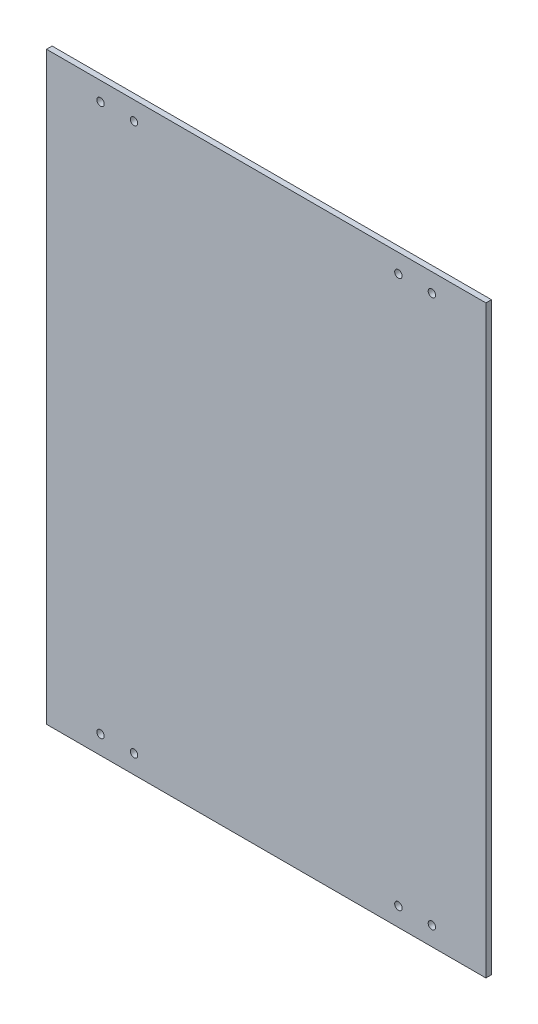
ISO-10303-21;
HEADER;
FILE_DESCRIPTION(('STEP AP214'),'2;1');
FILE_NAME('part.step','',(''),(''),'','','');
FILE_SCHEMA(('AUTOMOTIVE_DESIGN { 1 0 10303 214 1 1 1 1 }'));
ENDSEC;
DATA;
#1=APPLICATION_CONTEXT('core data for automotive mechanical design processes');
#2=APPLICATION_PROTOCOL_DEFINITION('international standard','automotive_design',2000,#1);
#3=PRODUCT_CONTEXT('',#1,'mechanical');
#4=PRODUCT('Part','Part','',(#3));
#5=PRODUCT_RELATED_PRODUCT_CATEGORY('part','',(#4));
#6=PRODUCT_DEFINITION_FORMATION('','',#4);
#7=PRODUCT_DEFINITION_CONTEXT('part definition',#1,'design');
#8=PRODUCT_DEFINITION('design','',#6,#7);
#9=PRODUCT_DEFINITION_SHAPE('','',#8);
#10=(LENGTH_UNIT() NAMED_UNIT(*) SI_UNIT(.MILLI.,.METRE.));
#11=(NAMED_UNIT(*) PLANE_ANGLE_UNIT() SI_UNIT($,.RADIAN.));
#12=(NAMED_UNIT(*) SI_UNIT($,.STERADIAN.) SOLID_ANGLE_UNIT());
#13=UNCERTAINTY_MEASURE_WITH_UNIT(LENGTH_MEASURE(1.E-05),#10,'distance_accuracy_value','');
#14=(GEOMETRIC_REPRESENTATION_CONTEXT(3) GLOBAL_UNCERTAINTY_ASSIGNED_CONTEXT((#13)) GLOBAL_UNIT_ASSIGNED_CONTEXT((#10,
#11,#12)) REPRESENTATION_CONTEXT('',''));
#15=CARTESIAN_POINT('',(0.,0.,0.));
#16=DIRECTION('',(0.,0.,1.));
#17=DIRECTION('',(1.,0.,0.));
#18=AXIS2_PLACEMENT_3D('',#15,#16,#17);
#19=CARTESIAN_POINT('',(-118.,154.,3.));
#20=DIRECTION('',(1.,0.,0.));
#21=DIRECTION('',(0.,1.,0.));
#22=AXIS2_PLACEMENT_3D('',#19,#20,#21);
#23=PLANE('',#22);
#24=DIRECTION('',(0.,-1.,0.));
#25=VECTOR('',#24,1.);
#26=CARTESIAN_POINT('',(-118.,154.,0.));
#27=LINE('',#26,#25);
#28=CARTESIAN_POINT('',(-118.,154.,0.));
#29=VERTEX_POINT('',#28);
#30=CARTESIAN_POINT('',(-118.,-160.,0.));
#31=VERTEX_POINT('',#30);
#32=EDGE_CURVE('E102',#29,#31,#27,.T.);
#33=ORIENTED_EDGE('',*,*,#32,.T.);
#34=DIRECTION('',(0.,0.,-1.));
#35=VECTOR('',#34,1.);
#36=CARTESIAN_POINT('',(-118.,-160.,3.));
#37=LINE('',#36,#35);
#38=CARTESIAN_POINT('',(-118.,-160.,3.));
#39=VERTEX_POINT('',#38);
#40=EDGE_CURVE('E11',#39,#31,#37,.T.);
#41=ORIENTED_EDGE('',*,*,#40,.F.);
#42=DIRECTION('',(0.,-1.,0.));
#43=VECTOR('',#42,1.);
#44=CARTESIAN_POINT('',(-118.,154.,3.));
#45=LINE('',#44,#43);
#46=CARTESIAN_POINT('',(-118.,154.,3.));
#47=VERTEX_POINT('',#46);
#48=EDGE_CURVE('E90',#47,#39,#45,.T.);
#49=ORIENTED_EDGE('',*,*,#48,.F.);
#50=DIRECTION('',(0.,0.,-1.));
#51=VECTOR('',#50,1.);
#52=CARTESIAN_POINT('',(-118.,154.,3.));
#53=LINE('',#52,#51);
#54=EDGE_CURVE('E98',#47,#29,#53,.T.);
#55=ORIENTED_EDGE('',*,*,#54,.T.);
#56=EDGE_LOOP('',(#33,#41,#49,#55));
#57=FACE_BOUND('',#56,.T.);
#58=ADVANCED_FACE('F39',(#57),#23,.F.);
#59=CARTESIAN_POINT('',(118.,-160.,3.));
#60=DIRECTION('',(0.,1.,0.));
#61=DIRECTION('',(-1.,0.,0.));
#62=AXIS2_PLACEMENT_3D('',#59,#60,#61);
#63=PLANE('',#62);
#64=DIRECTION('',(1.,0.,0.));
#65=VECTOR('',#64,1.);
#66=CARTESIAN_POINT('',(118.,-160.,0.));
#67=LINE('',#66,#65);
#68=CARTESIAN_POINT('',(118.,-160.,0.));
#69=VERTEX_POINT('',#68);
#70=EDGE_CURVE('E94',#31,#69,#67,.T.);
#71=ORIENTED_EDGE('',*,*,#70,.T.);
#72=DIRECTION('',(0.,0.,-1.));
#73=VECTOR('',#72,1.);
#74=CARTESIAN_POINT('',(118.,-160.,3.));
#75=LINE('',#74,#73);
#76=CARTESIAN_POINT('',(118.,-160.,3.));
#77=VERTEX_POINT('',#76);
#78=EDGE_CURVE('E47',#77,#69,#75,.T.);
#79=ORIENTED_EDGE('',*,*,#78,.F.);
#80=DIRECTION('',(1.,0.,0.));
#81=VECTOR('',#80,1.);
#82=CARTESIAN_POINT('',(118.,-160.,3.));
#83=LINE('',#82,#81);
#84=EDGE_CURVE('E85',#39,#77,#83,.T.);
#85=ORIENTED_EDGE('',*,*,#84,.F.);
#86=ORIENTED_EDGE('',*,*,#40,.T.);
#87=EDGE_LOOP('',(#71,#79,#85,#86));
#88=FACE_BOUND('',#87,.T.);
#89=ADVANCED_FACE('F93',(#88),#63,.F.);
#90=CARTESIAN_POINT('',(118.,154.,3.));
#91=DIRECTION('',(-1.,0.,0.));
#92=DIRECTION('',(0.,-1.,0.));
#93=AXIS2_PLACEMENT_3D('',#90,#91,#92);
#94=PLANE('',#93);
#95=DIRECTION('',(0.,1.,0.));
#96=VECTOR('',#95,1.);
#97=CARTESIAN_POINT('',(118.,154.,0.));
#98=LINE('',#97,#96);
#99=CARTESIAN_POINT('',(118.,154.,0.));
#100=VERTEX_POINT('',#99);
#101=EDGE_CURVE('E72',#69,#100,#98,.T.);
#102=ORIENTED_EDGE('',*,*,#101,.T.);
#103=DIRECTION('',(0.,0.,-1.));
#104=VECTOR('',#103,1.);
#105=CARTESIAN_POINT('',(118.,154.,3.));
#106=LINE('',#105,#104);
#107=CARTESIAN_POINT('',(118.,154.,3.));
#108=VERTEX_POINT('',#107);
#109=EDGE_CURVE('E95',#108,#100,#106,.T.);
#110=ORIENTED_EDGE('',*,*,#109,.F.);
#111=DIRECTION('',(0.,1.,0.));
#112=VECTOR('',#111,1.);
#113=CARTESIAN_POINT('',(118.,154.,3.));
#114=LINE('',#113,#112);
#115=EDGE_CURVE('E88',#77,#108,#114,.T.);
#116=ORIENTED_EDGE('',*,*,#115,.F.);
#117=ORIENTED_EDGE('',*,*,#78,.T.);
#118=EDGE_LOOP('',(#102,#110,#116,#117));
#119=FACE_BOUND('',#118,.T.);
#120=ADVANCED_FACE('F96',(#119),#94,.F.);
#121=CARTESIAN_POINT('',(-118.,154.,3.));
#122=DIRECTION('',(0.,-1.,0.));
#123=DIRECTION('',(0.,0.,-1.));
#124=AXIS2_PLACEMENT_3D('',#121,#122,#123);
#125=PLANE('',#124);
#126=DIRECTION('',(-1.,0.,0.));
#127=VECTOR('',#126,1.);
#128=CARTESIAN_POINT('',(-118.,154.,0.));
#129=LINE('',#128,#127);
#130=EDGE_CURVE('E78',#100,#29,#129,.T.);
#131=ORIENTED_EDGE('',*,*,#130,.T.);
#132=ORIENTED_EDGE('',*,*,#54,.F.);
#133=DIRECTION('',(-1.,0.,0.));
#134=VECTOR('',#133,1.);
#135=CARTESIAN_POINT('',(-118.,154.,3.));
#136=LINE('',#135,#134);
#137=EDGE_CURVE('E55',#108,#47,#136,.T.);
#138=ORIENTED_EDGE('',*,*,#137,.F.);
#139=ORIENTED_EDGE('',*,*,#109,.T.);
#140=EDGE_LOOP('',(#131,#132,#138,#139));
#141=FACE_BOUND('',#140,.T.);
#142=ADVANCED_FACE('F110',(#141),#125,.F.);
#143=CARTESIAN_POINT('',(0.,0.,3.));
#144=DIRECTION('',(0.,0.,-1.));
#145=DIRECTION('',(-1.,0.,0.));
#146=AXIS2_PLACEMENT_3D('',#143,#144,#145);
#147=PLANE('',#146);
#148=CARTESIAN_POINT('',(89.,-150.,3.));
#149=DIRECTION('',(0.,0.,-1.));
#150=DIRECTION('',(-1.,0.,0.));
#151=AXIS2_PLACEMENT_3D('',#148,#149,#150);
#152=CIRCLE('',#151,2.);
#153=CARTESIAN_POINT('',(91.,-150.,3.));
#154=VERTEX_POINT('',#153);
#155=EDGE_CURVE('E160',#154,#154,#152,.T.);
#156=ORIENTED_EDGE('',*,*,#155,.T.);
#157=EDGE_LOOP('',(#156));
#158=FACE_BOUND('',#157,.T.);
#159=CARTESIAN_POINT('',(71.,-150.,3.));
#160=DIRECTION('',(0.,0.,-1.));
#161=DIRECTION('',(-1.,0.,0.));
#162=AXIS2_PLACEMENT_3D('',#159,#160,#161);
#163=CIRCLE('',#162,2.);
#164=CARTESIAN_POINT('',(73.,-150.,3.));
#165=VERTEX_POINT('',#164);
#166=EDGE_CURVE('E154',#165,#165,#163,.T.);
#167=ORIENTED_EDGE('',*,*,#166,.T.);
#168=EDGE_LOOP('',(#167));
#169=FACE_BOUND('',#168,.T.);
#170=CARTESIAN_POINT('',(89.,144.,3.));
#171=DIRECTION('',(0.,0.,1.));
#172=DIRECTION('',(1.,0.,0.));
#173=AXIS2_PLACEMENT_3D('',#170,#171,#172);
#174=CIRCLE('',#173,2.);
#175=CARTESIAN_POINT('',(91.,144.,3.));
#176=VERTEX_POINT('',#175);
#177=EDGE_CURVE('E125',#176,#176,#174,.T.);
#178=ORIENTED_EDGE('',*,*,#177,.F.);
#179=EDGE_LOOP('',(#178));
#180=FACE_BOUND('',#179,.T.);
#181=CARTESIAN_POINT('',(71.,144.,3.));
#182=DIRECTION('',(0.,0.,1.));
#183=DIRECTION('',(1.,0.,0.));
#184=AXIS2_PLACEMENT_3D('',#181,#182,#183);
#185=CIRCLE('',#184,2.00000000000001);
#186=CARTESIAN_POINT('',(73.,144.,3.));
#187=VERTEX_POINT('',#186);
#188=EDGE_CURVE('E132',#187,#187,#185,.T.);
#189=ORIENTED_EDGE('',*,*,#188,.F.);
#190=EDGE_LOOP('',(#189));
#191=FACE_BOUND('',#190,.T.);
#192=CARTESIAN_POINT('',(-71.,144.,3.));
#193=DIRECTION('',(0.,0.,1.));
#194=DIRECTION('',(-1.,0.,0.));
#195=AXIS2_PLACEMENT_3D('',#192,#193,#194);
#196=CIRCLE('',#195,2.00000000000001);
#197=CARTESIAN_POINT('',(-69.,144.,3.));
#198=VERTEX_POINT('',#197);
#199=EDGE_CURVE('E138',#198,#198,#196,.T.);
#200=ORIENTED_EDGE('',*,*,#199,.F.);
#201=EDGE_LOOP('',(#200));
#202=FACE_BOUND('',#201,.T.);
#203=CARTESIAN_POINT('',(-89.,144.,3.));
#204=DIRECTION('',(0.,0.,1.));
#205=DIRECTION('',(-1.,0.,0.));
#206=AXIS2_PLACEMENT_3D('',#203,#204,#205);
#207=CIRCLE('',#206,2.);
#208=CARTESIAN_POINT('',(-87.,144.,3.));
#209=VERTEX_POINT('',#208);
#210=EDGE_CURVE('E144',#209,#209,#207,.T.);
#211=ORIENTED_EDGE('',*,*,#210,.F.);
#212=EDGE_LOOP('',(#211));
#213=FACE_BOUND('',#212,.T.);
#214=CARTESIAN_POINT('',(-89.,-150.,3.));
#215=DIRECTION('',(0.,0.,1.));
#216=DIRECTION('',(1.,0.,0.));
#217=AXIS2_PLACEMENT_3D('',#214,#215,#216);
#218=CIRCLE('',#217,2.);
#219=CARTESIAN_POINT('',(-87.,-150.,3.));
#220=VERTEX_POINT('',#219);
#221=EDGE_CURVE('E119',#220,#220,#218,.T.);
#222=ORIENTED_EDGE('',*,*,#221,.F.);
#223=EDGE_LOOP('',(#222));
#224=FACE_BOUND('',#223,.T.);
#225=CARTESIAN_POINT('',(-71.,-150.,3.));
#226=DIRECTION('',(0.,0.,1.));
#227=DIRECTION('',(1.,0.,0.));
#228=AXIS2_PLACEMENT_3D('',#225,#226,#227);
#229=CIRCLE('',#228,2.);
#230=CARTESIAN_POINT('',(-69.,-150.,3.));
#231=VERTEX_POINT('',#230);
#232=EDGE_CURVE('E105',#231,#231,#229,.T.);
#233=ORIENTED_EDGE('',*,*,#232,.F.);
#234=EDGE_LOOP('',(#233));
#235=FACE_BOUND('',#234,.T.);
#236=ORIENTED_EDGE('',*,*,#48,.T.);
#237=ORIENTED_EDGE('',*,*,#84,.T.);
#238=ORIENTED_EDGE('',*,*,#115,.T.);
#239=ORIENTED_EDGE('',*,*,#137,.T.);
#240=EDGE_LOOP('',(#236,#237,#238,#239));
#241=FACE_BOUND('',#240,.T.);
#242=ADVANCED_FACE('F86',(#158,#169,#180,#191,#202,#213,#224,#235,#241),#147,.F.);
#243=CARTESIAN_POINT('',(0.,0.,0.));
#244=DIRECTION('',(0.,0.,-1.));
#245=DIRECTION('',(-1.,0.,0.));
#246=AXIS2_PLACEMENT_3D('',#243,#244,#245);
#247=PLANE('',#246);
#248=CARTESIAN_POINT('',(89.,-150.,0.));
#249=DIRECTION('',(0.,0.,-1.));
#250=DIRECTION('',(-1.,0.,0.));
#251=AXIS2_PLACEMENT_3D('',#248,#249,#250);
#252=CIRCLE('',#251,2.);
#253=CARTESIAN_POINT('',(91.,-150.,0.));
#254=VERTEX_POINT('',#253);
#255=EDGE_CURVE('E157',#254,#254,#252,.T.);
#256=ORIENTED_EDGE('',*,*,#255,.F.);
#257=EDGE_LOOP('',(#256));
#258=FACE_BOUND('',#257,.T.);
#259=CARTESIAN_POINT('',(71.,-150.,0.));
#260=DIRECTION('',(0.,0.,-1.));
#261=DIRECTION('',(-1.,0.,0.));
#262=AXIS2_PLACEMENT_3D('',#259,#260,#261);
#263=CIRCLE('',#262,2.);
#264=CARTESIAN_POINT('',(73.,-150.,0.));
#265=VERTEX_POINT('',#264);
#266=EDGE_CURVE('E126',#265,#265,#263,.T.);
#267=ORIENTED_EDGE('',*,*,#266,.F.);
#268=EDGE_LOOP('',(#267));
#269=FACE_BOUND('',#268,.T.);
#270=CARTESIAN_POINT('',(89.,144.,0.));
#271=DIRECTION('',(0.,0.,-1.));
#272=DIRECTION('',(-1.,0.,0.));
#273=AXIS2_PLACEMENT_3D('',#270,#271,#272);
#274=CIRCLE('',#273,2.);
#275=CARTESIAN_POINT('',(91.,144.,0.));
#276=VERTEX_POINT('',#275);
#277=EDGE_CURVE('E122',#276,#276,#274,.F.);
#278=ORIENTED_EDGE('',*,*,#277,.T.);
#279=EDGE_LOOP('',(#278));
#280=FACE_BOUND('',#279,.T.);
#281=CARTESIAN_POINT('',(71.,144.,0.));
#282=DIRECTION('',(0.,0.,-1.));
#283=DIRECTION('',(-1.,0.,0.));
#284=AXIS2_PLACEMENT_3D('',#281,#282,#283);
#285=CIRCLE('',#284,2.00000000000001);
#286=CARTESIAN_POINT('',(73.,144.,0.));
#287=VERTEX_POINT('',#286);
#288=EDGE_CURVE('E129',#287,#287,#285,.F.);
#289=ORIENTED_EDGE('',*,*,#288,.T.);
#290=EDGE_LOOP('',(#289));
#291=FACE_BOUND('',#290,.T.);
#292=CARTESIAN_POINT('',(-71.,144.,0.));
#293=DIRECTION('',(0.,0.,-1.));
#294=DIRECTION('',(-1.,0.,0.));
#295=AXIS2_PLACEMENT_3D('',#292,#293,#294);
#296=CIRCLE('',#295,2.00000000000001);
#297=CARTESIAN_POINT('',(-69.,144.,0.));
#298=VERTEX_POINT('',#297);
#299=EDGE_CURVE('E135',#298,#298,#296,.F.);
#300=ORIENTED_EDGE('',*,*,#299,.T.);
#301=EDGE_LOOP('',(#300));
#302=FACE_BOUND('',#301,.T.);
#303=CARTESIAN_POINT('',(-89.,144.,0.));
#304=DIRECTION('',(0.,0.,-1.));
#305=DIRECTION('',(-1.,0.,0.));
#306=AXIS2_PLACEMENT_3D('',#303,#304,#305);
#307=CIRCLE('',#306,2.);
#308=CARTESIAN_POINT('',(-87.,144.,0.));
#309=VERTEX_POINT('',#308);
#310=EDGE_CURVE('E141',#309,#309,#307,.F.);
#311=ORIENTED_EDGE('',*,*,#310,.T.);
#312=EDGE_LOOP('',(#311));
#313=FACE_BOUND('',#312,.T.);
#314=CARTESIAN_POINT('',(-89.,-150.,0.));
#315=DIRECTION('',(0.,0.,-1.));
#316=DIRECTION('',(-1.,0.,0.));
#317=AXIS2_PLACEMENT_3D('',#314,#315,#316);
#318=CIRCLE('',#317,2.);
#319=CARTESIAN_POINT('',(-87.,-150.,0.));
#320=VERTEX_POINT('',#319);
#321=EDGE_CURVE('E147',#320,#320,#318,.F.);
#322=ORIENTED_EDGE('',*,*,#321,.T.);
#323=EDGE_LOOP('',(#322));
#324=FACE_BOUND('',#323,.T.);
#325=CARTESIAN_POINT('',(-71.,-150.,0.));
#326=DIRECTION('',(0.,0.,-1.));
#327=DIRECTION('',(-1.,0.,0.));
#328=AXIS2_PLACEMENT_3D('',#325,#326,#327);
#329=CIRCLE('',#328,2.);
#330=CARTESIAN_POINT('',(-69.,-150.,0.));
#331=VERTEX_POINT('',#330);
#332=EDGE_CURVE('E116',#331,#331,#329,.F.);
#333=ORIENTED_EDGE('',*,*,#332,.T.);
#334=EDGE_LOOP('',(#333));
#335=FACE_BOUND('',#334,.T.);
#336=ORIENTED_EDGE('',*,*,#32,.F.);
#337=ORIENTED_EDGE('',*,*,#130,.F.);
#338=ORIENTED_EDGE('',*,*,#101,.F.);
#339=ORIENTED_EDGE('',*,*,#70,.F.);
#340=EDGE_LOOP('',(#336,#337,#338,#339));
#341=FACE_BOUND('',#340,.T.);
#342=ADVANCED_FACE('F113',(#258,#269,#280,#291,#302,#313,#324,#335,#341),#247,.T.);
#343=CARTESIAN_POINT('',(-71.,-150.,-0.00100000000000013));
#344=DIRECTION('',(0.,0.,1.));
#345=DIRECTION('',(1.,0.,0.));
#346=AXIS2_PLACEMENT_3D('',#343,#344,#345);
#347=CYLINDRICAL_SURFACE('',#346,2.);
#348=CARTESIAN_POINT('',(-69.,-150.,0.));
#349=CARTESIAN_POINT('',(-69.,-150.,0.03125));
#350=CARTESIAN_POINT('',(-69.,-150.,0.0625));
#351=CARTESIAN_POINT('',(-69.,-150.,0.125));
#352=CARTESIAN_POINT('',(-69.,-150.,0.15625));
#353=CARTESIAN_POINT('',(-69.,-150.,0.21875));
#354=CARTESIAN_POINT('',(-69.,-150.,0.25));
#355=CARTESIAN_POINT('',(-69.,-150.,0.3125));
#356=CARTESIAN_POINT('',(-69.,-150.,0.34375));
#357=CARTESIAN_POINT('',(-69.,-150.,0.40625));
#358=CARTESIAN_POINT('',(-69.,-150.,0.4375));
#359=CARTESIAN_POINT('',(-69.,-150.,0.5));
#360=CARTESIAN_POINT('',(-69.,-150.,0.53125));
#361=CARTESIAN_POINT('',(-69.,-150.,0.59375));
#362=CARTESIAN_POINT('',(-69.,-150.,0.625));
#363=CARTESIAN_POINT('',(-69.,-150.,0.6875));
#364=CARTESIAN_POINT('',(-69.,-150.,0.71875));
#365=CARTESIAN_POINT('',(-69.,-150.,0.78125));
#366=CARTESIAN_POINT('',(-69.,-150.,0.8125));
#367=CARTESIAN_POINT('',(-69.,-150.,0.875));
#368=CARTESIAN_POINT('',(-69.,-150.,0.90625));
#369=CARTESIAN_POINT('',(-69.,-150.,0.96875));
#370=CARTESIAN_POINT('',(-69.,-150.,1.));
#371=CARTESIAN_POINT('',(-69.,-150.,1.0625));
#372=CARTESIAN_POINT('',(-69.,-150.,1.09375));
#373=CARTESIAN_POINT('',(-69.,-150.,1.15625));
#374=CARTESIAN_POINT('',(-69.,-150.,1.1875));
#375=CARTESIAN_POINT('',(-69.,-150.,1.25));
#376=CARTESIAN_POINT('',(-69.,-150.,1.28125));
#377=CARTESIAN_POINT('',(-69.,-150.,1.34375));
#378=CARTESIAN_POINT('',(-69.,-150.,1.375));
#379=CARTESIAN_POINT('',(-69.,-150.,1.4375));
#380=CARTESIAN_POINT('',(-69.,-150.,1.46875));
#381=CARTESIAN_POINT('',(-69.,-150.,1.53125));
#382=CARTESIAN_POINT('',(-69.,-150.,1.5625));
#383=CARTESIAN_POINT('',(-69.,-150.,1.625));
#384=CARTESIAN_POINT('',(-69.,-150.,1.65625));
#385=CARTESIAN_POINT('',(-69.,-150.,1.71875));
#386=CARTESIAN_POINT('',(-69.,-150.,1.75));
#387=CARTESIAN_POINT('',(-69.,-150.,1.8125));
#388=CARTESIAN_POINT('',(-69.,-150.,1.84375));
#389=CARTESIAN_POINT('',(-69.,-150.,1.90625));
#390=CARTESIAN_POINT('',(-69.,-150.,1.9375));
#391=CARTESIAN_POINT('',(-69.,-150.,2.));
#392=CARTESIAN_POINT('',(-69.,-150.,2.03125));
#393=CARTESIAN_POINT('',(-69.,-150.,2.09375));
#394=CARTESIAN_POINT('',(-69.,-150.,2.125));
#395=CARTESIAN_POINT('',(-69.,-150.,2.1875));
#396=CARTESIAN_POINT('',(-69.,-150.,2.21875));
#397=CARTESIAN_POINT('',(-69.,-150.,2.28125));
#398=CARTESIAN_POINT('',(-69.,-150.,2.3125));
#399=CARTESIAN_POINT('',(-69.,-150.,2.375));
#400=CARTESIAN_POINT('',(-69.,-150.,2.40625));
#401=CARTESIAN_POINT('',(-69.,-150.,2.46875));
#402=CARTESIAN_POINT('',(-69.,-150.,2.5));
#403=CARTESIAN_POINT('',(-69.,-150.,2.5625));
#404=CARTESIAN_POINT('',(-69.,-150.,2.59375));
#405=CARTESIAN_POINT('',(-69.,-150.,2.65625));
#406=CARTESIAN_POINT('',(-69.,-150.,2.6875));
#407=CARTESIAN_POINT('',(-69.,-150.,2.75));
#408=CARTESIAN_POINT('',(-69.,-150.,2.78125));
#409=CARTESIAN_POINT('',(-69.,-150.,2.84375));
#410=CARTESIAN_POINT('',(-69.,-150.,2.875));
#411=CARTESIAN_POINT('',(-69.,-150.,2.9375));
#412=CARTESIAN_POINT('',(-69.,-150.,2.96875));
#413=CARTESIAN_POINT('',(-69.,-150.,3.));
#414=B_SPLINE_CURVE_WITH_KNOTS('',3,(#348,#349,#350,#351,#352,#353,#354,#355,#356,#357,#358,
#359,#360,#361,#362,#363,#364,#365,#366,#367,#368,#369,#370,#371,#372,#373,#374,#375,#376,#377,
#378,#379,#380,#381,#382,#383,#384,#385,#386,#387,#388,#389,#390,#391,#392,#393,#394,#395,#396,
#397,#398,#399,#400,#401,#402,#403,#404,#405,#406,#407,#408,#409,#410,#411,#412,#413),
.UNSPECIFIED.,.F.,.F.,(4,2,2,2,2,2,2,2,2,2,2,2,2,2,2,2,2,2,2,2,2,2,2,2,2,2,2,2,2,2,2,2,4),(0.,
0.09375,0.1875,0.28125,0.375,0.46875,0.5625,0.65625,0.75,0.84375,0.9375,1.03125,1.125,1.21875,
1.3125,1.40625,1.5,1.59375,1.6875,1.78125,1.875,1.96875,2.0625,2.15625,2.25,2.34375,2.4375,
2.53125,2.625,2.71875,2.8125,2.90625,3.),.UNSPECIFIED.);
#415=EDGE_CURVE('BSEAM190',#331,#231,#414,.T.);
#416=ORIENTED_EDGE('',*,*,#332,.F.);
#417=ORIENTED_EDGE('',*,*,#232,.T.);
#418=ORIENTED_EDGE('',*,*,#415,.T.);
#419=ORIENTED_EDGE('',*,*,#415,.F.);
#420=EDGE_LOOP('',(#416,#418,#417,#419));
#421=FACE_BOUND('',#420,.T.);
#422=ADVANCED_FACE('F190',(#421),#347,.F.);
#423=CARTESIAN_POINT('',(-89.,-150.,-0.00100000000000013));
#424=DIRECTION('',(0.,0.,1.));
#425=DIRECTION('',(1.,0.,0.));
#426=AXIS2_PLACEMENT_3D('',#423,#424,#425);
#427=CYLINDRICAL_SURFACE('',#426,2.);
#428=CARTESIAN_POINT('',(-87.,-150.,0.));
#429=CARTESIAN_POINT('',(-87.,-150.,0.03125));
#430=CARTESIAN_POINT('',(-87.,-150.,0.0625));
#431=CARTESIAN_POINT('',(-87.,-150.,0.125));
#432=CARTESIAN_POINT('',(-87.,-150.,0.15625));
#433=CARTESIAN_POINT('',(-87.,-150.,0.21875));
#434=CARTESIAN_POINT('',(-87.,-150.,0.25));
#435=CARTESIAN_POINT('',(-87.,-150.,0.3125));
#436=CARTESIAN_POINT('',(-87.,-150.,0.34375));
#437=CARTESIAN_POINT('',(-87.,-150.,0.40625));
#438=CARTESIAN_POINT('',(-87.,-150.,0.4375));
#439=CARTESIAN_POINT('',(-87.,-150.,0.5));
#440=CARTESIAN_POINT('',(-87.,-150.,0.53125));
#441=CARTESIAN_POINT('',(-87.,-150.,0.59375));
#442=CARTESIAN_POINT('',(-87.,-150.,0.625));
#443=CARTESIAN_POINT('',(-87.,-150.,0.6875));
#444=CARTESIAN_POINT('',(-87.,-150.,0.71875));
#445=CARTESIAN_POINT('',(-87.,-150.,0.78125));
#446=CARTESIAN_POINT('',(-87.,-150.,0.8125));
#447=CARTESIAN_POINT('',(-87.,-150.,0.875));
#448=CARTESIAN_POINT('',(-87.,-150.,0.90625));
#449=CARTESIAN_POINT('',(-87.,-150.,0.96875));
#450=CARTESIAN_POINT('',(-87.,-150.,1.));
#451=CARTESIAN_POINT('',(-87.,-150.,1.0625));
#452=CARTESIAN_POINT('',(-87.,-150.,1.09375));
#453=CARTESIAN_POINT('',(-87.,-150.,1.15625));
#454=CARTESIAN_POINT('',(-87.,-150.,1.1875));
#455=CARTESIAN_POINT('',(-87.,-150.,1.25));
#456=CARTESIAN_POINT('',(-87.,-150.,1.28125));
#457=CARTESIAN_POINT('',(-87.,-150.,1.34375));
#458=CARTESIAN_POINT('',(-87.,-150.,1.375));
#459=CARTESIAN_POINT('',(-87.,-150.,1.4375));
#460=CARTESIAN_POINT('',(-87.,-150.,1.46875));
#461=CARTESIAN_POINT('',(-87.,-150.,1.53125));
#462=CARTESIAN_POINT('',(-87.,-150.,1.5625));
#463=CARTESIAN_POINT('',(-87.,-150.,1.625));
#464=CARTESIAN_POINT('',(-87.,-150.,1.65625));
#465=CARTESIAN_POINT('',(-87.,-150.,1.71875));
#466=CARTESIAN_POINT('',(-87.,-150.,1.75));
#467=CARTESIAN_POINT('',(-87.,-150.,1.8125));
#468=CARTESIAN_POINT('',(-87.,-150.,1.84375));
#469=CARTESIAN_POINT('',(-87.,-150.,1.90625));
#470=CARTESIAN_POINT('',(-87.,-150.,1.9375));
#471=CARTESIAN_POINT('',(-87.,-150.,2.));
#472=CARTESIAN_POINT('',(-87.,-150.,2.03125));
#473=CARTESIAN_POINT('',(-87.,-150.,2.09375));
#474=CARTESIAN_POINT('',(-87.,-150.,2.125));
#475=CARTESIAN_POINT('',(-87.,-150.,2.1875));
#476=CARTESIAN_POINT('',(-87.,-150.,2.21875));
#477=CARTESIAN_POINT('',(-87.,-150.,2.28125));
#478=CARTESIAN_POINT('',(-87.,-150.,2.3125));
#479=CARTESIAN_POINT('',(-87.,-150.,2.375));
#480=CARTESIAN_POINT('',(-87.,-150.,2.40625));
#481=CARTESIAN_POINT('',(-87.,-150.,2.46875));
#482=CARTESIAN_POINT('',(-87.,-150.,2.5));
#483=CARTESIAN_POINT('',(-87.,-150.,2.5625));
#484=CARTESIAN_POINT('',(-87.,-150.,2.59375));
#485=CARTESIAN_POINT('',(-87.,-150.,2.65625));
#486=CARTESIAN_POINT('',(-87.,-150.,2.6875));
#487=CARTESIAN_POINT('',(-87.,-150.,2.75));
#488=CARTESIAN_POINT('',(-87.,-150.,2.78125));
#489=CARTESIAN_POINT('',(-87.,-150.,2.84375));
#490=CARTESIAN_POINT('',(-87.,-150.,2.875));
#491=CARTESIAN_POINT('',(-87.,-150.,2.9375));
#492=CARTESIAN_POINT('',(-87.,-150.,2.96875));
#493=CARTESIAN_POINT('',(-87.,-150.,3.));
#494=B_SPLINE_CURVE_WITH_KNOTS('',3,(#428,#429,#430,#431,#432,#433,#434,#435,#436,#437,#438,
#439,#440,#441,#442,#443,#444,#445,#446,#447,#448,#449,#450,#451,#452,#453,#454,#455,#456,#457,
#458,#459,#460,#461,#462,#463,#464,#465,#466,#467,#468,#469,#470,#471,#472,#473,#474,#475,#476,
#477,#478,#479,#480,#481,#482,#483,#484,#485,#486,#487,#488,#489,#490,#491,#492,#493),
.UNSPECIFIED.,.F.,.F.,(4,2,2,2,2,2,2,2,2,2,2,2,2,2,2,2,2,2,2,2,2,2,2,2,2,2,2,2,2,2,2,2,4),(0.,
0.09375,0.1875,0.28125,0.375,0.46875,0.5625,0.65625,0.75,0.84375,0.9375,1.03125,1.125,1.21875,
1.3125,1.40625,1.5,1.59375,1.6875,1.78125,1.875,1.96875,2.0625,2.15625,2.25,2.34375,2.4375,
2.53125,2.625,2.71875,2.8125,2.90625,3.),.UNSPECIFIED.);
#495=EDGE_CURVE('BSEAM196',#320,#220,#494,.T.);
#496=ORIENTED_EDGE('',*,*,#321,.F.);
#497=ORIENTED_EDGE('',*,*,#221,.T.);
#498=ORIENTED_EDGE('',*,*,#495,.T.);
#499=ORIENTED_EDGE('',*,*,#495,.F.);
#500=EDGE_LOOP('',(#496,#498,#497,#499));
#501=FACE_BOUND('',#500,.T.);
#502=ADVANCED_FACE('F196',(#501),#427,.F.);
#503=CARTESIAN_POINT('',(-89.,144.,-0.00100000000000013));
#504=DIRECTION('',(0.,0.,1.));
#505=DIRECTION('',(1.,0.,0.));
#506=AXIS2_PLACEMENT_3D('',#503,#504,#505);
#507=CYLINDRICAL_SURFACE('',#506,2.);
#508=CARTESIAN_POINT('',(-87.,144.,0.));
#509=CARTESIAN_POINT('',(-87.,144.,0.03125));
#510=CARTESIAN_POINT('',(-87.,144.,0.0625));
#511=CARTESIAN_POINT('',(-87.,144.,0.125));
#512=CARTESIAN_POINT('',(-87.,144.,0.15625));
#513=CARTESIAN_POINT('',(-87.,144.,0.21875));
#514=CARTESIAN_POINT('',(-87.,144.,0.25));
#515=CARTESIAN_POINT('',(-87.,144.,0.3125));
#516=CARTESIAN_POINT('',(-87.,144.,0.34375));
#517=CARTESIAN_POINT('',(-87.,144.,0.40625));
#518=CARTESIAN_POINT('',(-87.,144.,0.4375));
#519=CARTESIAN_POINT('',(-87.,144.,0.5));
#520=CARTESIAN_POINT('',(-87.,144.,0.53125));
#521=CARTESIAN_POINT('',(-87.,144.,0.59375));
#522=CARTESIAN_POINT('',(-87.,144.,0.625));
#523=CARTESIAN_POINT('',(-87.,144.,0.6875));
#524=CARTESIAN_POINT('',(-87.,144.,0.71875));
#525=CARTESIAN_POINT('',(-87.,144.,0.78125));
#526=CARTESIAN_POINT('',(-87.,144.,0.8125));
#527=CARTESIAN_POINT('',(-87.,144.,0.875));
#528=CARTESIAN_POINT('',(-87.,144.,0.90625));
#529=CARTESIAN_POINT('',(-87.,144.,0.96875));
#530=CARTESIAN_POINT('',(-87.,144.,1.));
#531=CARTESIAN_POINT('',(-87.,144.,1.0625));
#532=CARTESIAN_POINT('',(-87.,144.,1.09375));
#533=CARTESIAN_POINT('',(-87.,144.,1.15625));
#534=CARTESIAN_POINT('',(-87.,144.,1.1875));
#535=CARTESIAN_POINT('',(-87.,144.,1.25));
#536=CARTESIAN_POINT('',(-87.,144.,1.28125));
#537=CARTESIAN_POINT('',(-87.,144.,1.34375));
#538=CARTESIAN_POINT('',(-87.,144.,1.375));
#539=CARTESIAN_POINT('',(-87.,144.,1.4375));
#540=CARTESIAN_POINT('',(-87.,144.,1.46875));
#541=CARTESIAN_POINT('',(-87.,144.,1.53125));
#542=CARTESIAN_POINT('',(-87.,144.,1.5625));
#543=CARTESIAN_POINT('',(-87.,144.,1.625));
#544=CARTESIAN_POINT('',(-87.,144.,1.65625));
#545=CARTESIAN_POINT('',(-87.,144.,1.71875));
#546=CARTESIAN_POINT('',(-87.,144.,1.75));
#547=CARTESIAN_POINT('',(-87.,144.,1.8125));
#548=CARTESIAN_POINT('',(-87.,144.,1.84375));
#549=CARTESIAN_POINT('',(-87.,144.,1.90625));
#550=CARTESIAN_POINT('',(-87.,144.,1.9375));
#551=CARTESIAN_POINT('',(-87.,144.,2.));
#552=CARTESIAN_POINT('',(-87.,144.,2.03125));
#553=CARTESIAN_POINT('',(-87.,144.,2.09375));
#554=CARTESIAN_POINT('',(-87.,144.,2.125));
#555=CARTESIAN_POINT('',(-87.,144.,2.1875));
#556=CARTESIAN_POINT('',(-87.,144.,2.21875));
#557=CARTESIAN_POINT('',(-87.,144.,2.28125));
#558=CARTESIAN_POINT('',(-87.,144.,2.3125));
#559=CARTESIAN_POINT('',(-87.,144.,2.375));
#560=CARTESIAN_POINT('',(-87.,144.,2.40625));
#561=CARTESIAN_POINT('',(-87.,144.,2.46875));
#562=CARTESIAN_POINT('',(-87.,144.,2.5));
#563=CARTESIAN_POINT('',(-87.,144.,2.5625));
#564=CARTESIAN_POINT('',(-87.,144.,2.59375));
#565=CARTESIAN_POINT('',(-87.,144.,2.65625));
#566=CARTESIAN_POINT('',(-87.,144.,2.6875));
#567=CARTESIAN_POINT('',(-87.,144.,2.75));
#568=CARTESIAN_POINT('',(-87.,144.,2.78125));
#569=CARTESIAN_POINT('',(-87.,144.,2.84375));
#570=CARTESIAN_POINT('',(-87.,144.,2.875));
#571=CARTESIAN_POINT('',(-87.,144.,2.9375));
#572=CARTESIAN_POINT('',(-87.,144.,2.96875));
#573=CARTESIAN_POINT('',(-87.,144.,3.));
#574=B_SPLINE_CURVE_WITH_KNOTS('',3,(#508,#509,#510,#511,#512,#513,#514,#515,#516,#517,#518,
#519,#520,#521,#522,#523,#524,#525,#526,#527,#528,#529,#530,#531,#532,#533,#534,#535,#536,#537,
#538,#539,#540,#541,#542,#543,#544,#545,#546,#547,#548,#549,#550,#551,#552,#553,#554,#555,#556,
#557,#558,#559,#560,#561,#562,#563,#564,#565,#566,#567,#568,#569,#570,#571,#572,#573),
.UNSPECIFIED.,.F.,.F.,(4,2,2,2,2,2,2,2,2,2,2,2,2,2,2,2,2,2,2,2,2,2,2,2,2,2,2,2,2,2,2,2,4),(0.,
0.09375,0.1875,0.28125,0.375,0.46875,0.5625,0.65625,0.75,0.84375,0.9375,1.03125,1.125,1.21875,
1.3125,1.40625,1.5,1.59375,1.6875,1.78125,1.875,1.96875,2.0625,2.15625,2.25,2.34375,2.4375,
2.53125,2.625,2.71875,2.8125,2.90625,3.),.UNSPECIFIED.);
#575=EDGE_CURVE('BSEAM208',#309,#209,#574,.T.);
#576=ORIENTED_EDGE('',*,*,#310,.F.);
#577=ORIENTED_EDGE('',*,*,#210,.T.);
#578=ORIENTED_EDGE('',*,*,#575,.T.);
#579=ORIENTED_EDGE('',*,*,#575,.F.);
#580=EDGE_LOOP('',(#576,#578,#577,#579));
#581=FACE_BOUND('',#580,.T.);
#582=ADVANCED_FACE('F208',(#581),#507,.F.);
#583=CARTESIAN_POINT('',(-71.,144.,-0.00100000000000013));
#584=DIRECTION('',(0.,0.,1.));
#585=DIRECTION('',(1.,0.,0.));
#586=AXIS2_PLACEMENT_3D('',#583,#584,#585);
#587=CYLINDRICAL_SURFACE('',#586,2.00000000000001);
#588=CARTESIAN_POINT('',(-69.,144.,0.));
#589=CARTESIAN_POINT('',(-69.,144.,0.03125));
#590=CARTESIAN_POINT('',(-69.,144.,0.0625));
#591=CARTESIAN_POINT('',(-69.,144.,0.125));
#592=CARTESIAN_POINT('',(-69.,144.,0.15625));
#593=CARTESIAN_POINT('',(-69.,144.,0.21875));
#594=CARTESIAN_POINT('',(-69.,144.,0.25));
#595=CARTESIAN_POINT('',(-69.,144.,0.3125));
#596=CARTESIAN_POINT('',(-69.,144.,0.34375));
#597=CARTESIAN_POINT('',(-69.,144.,0.40625));
#598=CARTESIAN_POINT('',(-69.,144.,0.4375));
#599=CARTESIAN_POINT('',(-69.,144.,0.5));
#600=CARTESIAN_POINT('',(-69.,144.,0.53125));
#601=CARTESIAN_POINT('',(-69.,144.,0.59375));
#602=CARTESIAN_POINT('',(-69.,144.,0.625));
#603=CARTESIAN_POINT('',(-69.,144.,0.6875));
#604=CARTESIAN_POINT('',(-69.,144.,0.71875));
#605=CARTESIAN_POINT('',(-69.,144.,0.78125));
#606=CARTESIAN_POINT('',(-69.,144.,0.8125));
#607=CARTESIAN_POINT('',(-69.,144.,0.875));
#608=CARTESIAN_POINT('',(-69.,144.,0.90625));
#609=CARTESIAN_POINT('',(-69.,144.,0.96875));
#610=CARTESIAN_POINT('',(-69.,144.,1.));
#611=CARTESIAN_POINT('',(-69.,144.,1.0625));
#612=CARTESIAN_POINT('',(-69.,144.,1.09375));
#613=CARTESIAN_POINT('',(-69.,144.,1.15625));
#614=CARTESIAN_POINT('',(-69.,144.,1.1875));
#615=CARTESIAN_POINT('',(-69.,144.,1.25));
#616=CARTESIAN_POINT('',(-69.,144.,1.28125));
#617=CARTESIAN_POINT('',(-69.,144.,1.34375));
#618=CARTESIAN_POINT('',(-69.,144.,1.375));
#619=CARTESIAN_POINT('',(-69.,144.,1.4375));
#620=CARTESIAN_POINT('',(-69.,144.,1.46875));
#621=CARTESIAN_POINT('',(-69.,144.,1.53125));
#622=CARTESIAN_POINT('',(-69.,144.,1.5625));
#623=CARTESIAN_POINT('',(-69.,144.,1.625));
#624=CARTESIAN_POINT('',(-69.,144.,1.65625));
#625=CARTESIAN_POINT('',(-69.,144.,1.71875));
#626=CARTESIAN_POINT('',(-69.,144.,1.75));
#627=CARTESIAN_POINT('',(-69.,144.,1.8125));
#628=CARTESIAN_POINT('',(-69.,144.,1.84375));
#629=CARTESIAN_POINT('',(-69.,144.,1.90625));
#630=CARTESIAN_POINT('',(-69.,144.,1.9375));
#631=CARTESIAN_POINT('',(-69.,144.,2.));
#632=CARTESIAN_POINT('',(-69.,144.,2.03125));
#633=CARTESIAN_POINT('',(-69.,144.,2.09375));
#634=CARTESIAN_POINT('',(-69.,144.,2.125));
#635=CARTESIAN_POINT('',(-69.,144.,2.1875));
#636=CARTESIAN_POINT('',(-69.,144.,2.21875));
#637=CARTESIAN_POINT('',(-69.,144.,2.28125));
#638=CARTESIAN_POINT('',(-69.,144.,2.3125));
#639=CARTESIAN_POINT('',(-69.,144.,2.375));
#640=CARTESIAN_POINT('',(-69.,144.,2.40625));
#641=CARTESIAN_POINT('',(-69.,144.,2.46875));
#642=CARTESIAN_POINT('',(-69.,144.,2.5));
#643=CARTESIAN_POINT('',(-69.,144.,2.5625));
#644=CARTESIAN_POINT('',(-69.,144.,2.59375));
#645=CARTESIAN_POINT('',(-69.,144.,2.65625));
#646=CARTESIAN_POINT('',(-69.,144.,2.6875));
#647=CARTESIAN_POINT('',(-69.,144.,2.75));
#648=CARTESIAN_POINT('',(-69.,144.,2.78125));
#649=CARTESIAN_POINT('',(-69.,144.,2.84375));
#650=CARTESIAN_POINT('',(-69.,144.,2.875));
#651=CARTESIAN_POINT('',(-69.,144.,2.9375));
#652=CARTESIAN_POINT('',(-69.,144.,2.96875));
#653=CARTESIAN_POINT('',(-69.,144.,3.));
#654=B_SPLINE_CURVE_WITH_KNOTS('',3,(#588,#589,#590,#591,#592,#593,#594,#595,#596,#597,#598,
#599,#600,#601,#602,#603,#604,#605,#606,#607,#608,#609,#610,#611,#612,#613,#614,#615,#616,#617,
#618,#619,#620,#621,#622,#623,#624,#625,#626,#627,#628,#629,#630,#631,#632,#633,#634,#635,#636,
#637,#638,#639,#640,#641,#642,#643,#644,#645,#646,#647,#648,#649,#650,#651,#652,#653),
.UNSPECIFIED.,.F.,.F.,(4,2,2,2,2,2,2,2,2,2,2,2,2,2,2,2,2,2,2,2,2,2,2,2,2,2,2,2,2,2,2,2,4),(0.,
0.09375,0.1875,0.28125,0.375,0.46875,0.5625,0.65625,0.75,0.84375,0.9375,1.03125,1.125,1.21875,
1.3125,1.40625,1.5,1.59375,1.6875,1.78125,1.875,1.96875,2.0625,2.15625,2.25,2.34375,2.4375,
2.53125,2.625,2.71875,2.8125,2.90625,3.),.UNSPECIFIED.);
#655=EDGE_CURVE('BSEAM204',#298,#198,#654,.T.);
#656=ORIENTED_EDGE('',*,*,#299,.F.);
#657=ORIENTED_EDGE('',*,*,#199,.T.);
#658=ORIENTED_EDGE('',*,*,#655,.T.);
#659=ORIENTED_EDGE('',*,*,#655,.F.);
#660=EDGE_LOOP('',(#656,#658,#657,#659));
#661=FACE_BOUND('',#660,.T.);
#662=ADVANCED_FACE('F204',(#661),#587,.F.);
#663=CARTESIAN_POINT('',(71.,144.,-0.00100000000000013));
#664=DIRECTION('',(0.,0.,1.));
#665=DIRECTION('',(1.,0.,0.));
#666=AXIS2_PLACEMENT_3D('',#663,#664,#665);
#667=CYLINDRICAL_SURFACE('',#666,2.00000000000001);
#668=CARTESIAN_POINT('',(73.,144.,0.));
#669=CARTESIAN_POINT('',(73.,144.,0.03125));
#670=CARTESIAN_POINT('',(73.,144.,0.0625));
#671=CARTESIAN_POINT('',(73.,144.,0.125));
#672=CARTESIAN_POINT('',(73.,144.,0.15625));
#673=CARTESIAN_POINT('',(73.,144.,0.21875));
#674=CARTESIAN_POINT('',(73.,144.,0.25));
#675=CARTESIAN_POINT('',(73.,144.,0.3125));
#676=CARTESIAN_POINT('',(73.,144.,0.34375));
#677=CARTESIAN_POINT('',(73.,144.,0.40625));
#678=CARTESIAN_POINT('',(73.,144.,0.4375));
#679=CARTESIAN_POINT('',(73.,144.,0.5));
#680=CARTESIAN_POINT('',(73.,144.,0.53125));
#681=CARTESIAN_POINT('',(73.,144.,0.59375));
#682=CARTESIAN_POINT('',(73.,144.,0.625));
#683=CARTESIAN_POINT('',(73.,144.,0.6875));
#684=CARTESIAN_POINT('',(73.,144.,0.71875));
#685=CARTESIAN_POINT('',(73.,144.,0.78125));
#686=CARTESIAN_POINT('',(73.,144.,0.8125));
#687=CARTESIAN_POINT('',(73.,144.,0.875));
#688=CARTESIAN_POINT('',(73.,144.,0.90625));
#689=CARTESIAN_POINT('',(73.,144.,0.96875));
#690=CARTESIAN_POINT('',(73.,144.,1.));
#691=CARTESIAN_POINT('',(73.,144.,1.0625));
#692=CARTESIAN_POINT('',(73.,144.,1.09375));
#693=CARTESIAN_POINT('',(73.,144.,1.15625));
#694=CARTESIAN_POINT('',(73.,144.,1.1875));
#695=CARTESIAN_POINT('',(73.,144.,1.25));
#696=CARTESIAN_POINT('',(73.,144.,1.28125));
#697=CARTESIAN_POINT('',(73.,144.,1.34375));
#698=CARTESIAN_POINT('',(73.,144.,1.375));
#699=CARTESIAN_POINT('',(73.,144.,1.4375));
#700=CARTESIAN_POINT('',(73.,144.,1.46875));
#701=CARTESIAN_POINT('',(73.,144.,1.53125));
#702=CARTESIAN_POINT('',(73.,144.,1.5625));
#703=CARTESIAN_POINT('',(73.,144.,1.625));
#704=CARTESIAN_POINT('',(73.,144.,1.65625));
#705=CARTESIAN_POINT('',(73.,144.,1.71875));
#706=CARTESIAN_POINT('',(73.,144.,1.75));
#707=CARTESIAN_POINT('',(73.,144.,1.8125));
#708=CARTESIAN_POINT('',(73.,144.,1.84375));
#709=CARTESIAN_POINT('',(73.,144.,1.90625));
#710=CARTESIAN_POINT('',(73.,144.,1.9375));
#711=CARTESIAN_POINT('',(73.,144.,2.));
#712=CARTESIAN_POINT('',(73.,144.,2.03125));
#713=CARTESIAN_POINT('',(73.,144.,2.09375));
#714=CARTESIAN_POINT('',(73.,144.,2.125));
#715=CARTESIAN_POINT('',(73.,144.,2.1875));
#716=CARTESIAN_POINT('',(73.,144.,2.21875));
#717=CARTESIAN_POINT('',(73.,144.,2.28125));
#718=CARTESIAN_POINT('',(73.,144.,2.3125));
#719=CARTESIAN_POINT('',(73.,144.,2.375));
#720=CARTESIAN_POINT('',(73.,144.,2.40625));
#721=CARTESIAN_POINT('',(73.,144.,2.46875));
#722=CARTESIAN_POINT('',(73.,144.,2.5));
#723=CARTESIAN_POINT('',(73.,144.,2.5625));
#724=CARTESIAN_POINT('',(73.,144.,2.59375));
#725=CARTESIAN_POINT('',(73.,144.,2.65625));
#726=CARTESIAN_POINT('',(73.,144.,2.6875));
#727=CARTESIAN_POINT('',(73.,144.,2.75));
#728=CARTESIAN_POINT('',(73.,144.,2.78125));
#729=CARTESIAN_POINT('',(73.,144.,2.84375));
#730=CARTESIAN_POINT('',(73.,144.,2.875));
#731=CARTESIAN_POINT('',(73.,144.,2.9375));
#732=CARTESIAN_POINT('',(73.,144.,2.96875));
#733=CARTESIAN_POINT('',(73.,144.,3.));
#734=B_SPLINE_CURVE_WITH_KNOTS('',3,(#668,#669,#670,#671,#672,#673,#674,#675,#676,#677,#678,
#679,#680,#681,#682,#683,#684,#685,#686,#687,#688,#689,#690,#691,#692,#693,#694,#695,#696,#697,
#698,#699,#700,#701,#702,#703,#704,#705,#706,#707,#708,#709,#710,#711,#712,#713,#714,#715,#716,
#717,#718,#719,#720,#721,#722,#723,#724,#725,#726,#727,#728,#729,#730,#731,#732,#733),
.UNSPECIFIED.,.F.,.F.,(4,2,2,2,2,2,2,2,2,2,2,2,2,2,2,2,2,2,2,2,2,2,2,2,2,2,2,2,2,2,2,2,4),(0.,
0.09375,0.1875,0.28125,0.375,0.46875,0.5625,0.65625,0.75,0.84375,0.9375,1.03125,1.125,1.21875,
1.3125,1.40625,1.5,1.59375,1.6875,1.78125,1.875,1.96875,2.0625,2.15625,2.25,2.34375,2.4375,
2.53125,2.625,2.71875,2.8125,2.90625,3.),.UNSPECIFIED.);
#735=EDGE_CURVE('BSEAM200',#287,#187,#734,.T.);
#736=ORIENTED_EDGE('',*,*,#288,.F.);
#737=ORIENTED_EDGE('',*,*,#188,.T.);
#738=ORIENTED_EDGE('',*,*,#735,.T.);
#739=ORIENTED_EDGE('',*,*,#735,.F.);
#740=EDGE_LOOP('',(#736,#738,#737,#739));
#741=FACE_BOUND('',#740,.T.);
#742=ADVANCED_FACE('F200',(#741),#667,.F.);
#743=CARTESIAN_POINT('',(89.,144.,-0.00100000000000013));
#744=DIRECTION('',(0.,0.,1.));
#745=DIRECTION('',(1.,0.,0.));
#746=AXIS2_PLACEMENT_3D('',#743,#744,#745);
#747=CYLINDRICAL_SURFACE('',#746,2.);
#748=CARTESIAN_POINT('',(91.,144.,0.));
#749=CARTESIAN_POINT('',(91.,144.,0.03125));
#750=CARTESIAN_POINT('',(91.,144.,0.0625));
#751=CARTESIAN_POINT('',(91.,144.,0.125));
#752=CARTESIAN_POINT('',(91.,144.,0.15625));
#753=CARTESIAN_POINT('',(91.,144.,0.21875));
#754=CARTESIAN_POINT('',(91.,144.,0.25));
#755=CARTESIAN_POINT('',(91.,144.,0.3125));
#756=CARTESIAN_POINT('',(91.,144.,0.34375));
#757=CARTESIAN_POINT('',(91.,144.,0.40625));
#758=CARTESIAN_POINT('',(91.,144.,0.4375));
#759=CARTESIAN_POINT('',(91.,144.,0.5));
#760=CARTESIAN_POINT('',(91.,144.,0.53125));
#761=CARTESIAN_POINT('',(91.,144.,0.59375));
#762=CARTESIAN_POINT('',(91.,144.,0.625));
#763=CARTESIAN_POINT('',(91.,144.,0.6875));
#764=CARTESIAN_POINT('',(91.,144.,0.71875));
#765=CARTESIAN_POINT('',(91.,144.,0.78125));
#766=CARTESIAN_POINT('',(91.,144.,0.8125));
#767=CARTESIAN_POINT('',(91.,144.,0.875));
#768=CARTESIAN_POINT('',(91.,144.,0.90625));
#769=CARTESIAN_POINT('',(91.,144.,0.96875));
#770=CARTESIAN_POINT('',(91.,144.,1.));
#771=CARTESIAN_POINT('',(91.,144.,1.0625));
#772=CARTESIAN_POINT('',(91.,144.,1.09375));
#773=CARTESIAN_POINT('',(91.,144.,1.15625));
#774=CARTESIAN_POINT('',(91.,144.,1.1875));
#775=CARTESIAN_POINT('',(91.,144.,1.25));
#776=CARTESIAN_POINT('',(91.,144.,1.28125));
#777=CARTESIAN_POINT('',(91.,144.,1.34375));
#778=CARTESIAN_POINT('',(91.,144.,1.375));
#779=CARTESIAN_POINT('',(91.,144.,1.4375));
#780=CARTESIAN_POINT('',(91.,144.,1.46875));
#781=CARTESIAN_POINT('',(91.,144.,1.53125));
#782=CARTESIAN_POINT('',(91.,144.,1.5625));
#783=CARTESIAN_POINT('',(91.,144.,1.625));
#784=CARTESIAN_POINT('',(91.,144.,1.65625));
#785=CARTESIAN_POINT('',(91.,144.,1.71875));
#786=CARTESIAN_POINT('',(91.,144.,1.75));
#787=CARTESIAN_POINT('',(91.,144.,1.8125));
#788=CARTESIAN_POINT('',(91.,144.,1.84375));
#789=CARTESIAN_POINT('',(91.,144.,1.90625));
#790=CARTESIAN_POINT('',(91.,144.,1.9375));
#791=CARTESIAN_POINT('',(91.,144.,2.));
#792=CARTESIAN_POINT('',(91.,144.,2.03125));
#793=CARTESIAN_POINT('',(91.,144.,2.09375));
#794=CARTESIAN_POINT('',(91.,144.,2.125));
#795=CARTESIAN_POINT('',(91.,144.,2.1875));
#796=CARTESIAN_POINT('',(91.,144.,2.21875));
#797=CARTESIAN_POINT('',(91.,144.,2.28125));
#798=CARTESIAN_POINT('',(91.,144.,2.3125));
#799=CARTESIAN_POINT('',(91.,144.,2.375));
#800=CARTESIAN_POINT('',(91.,144.,2.40625));
#801=CARTESIAN_POINT('',(91.,144.,2.46875));
#802=CARTESIAN_POINT('',(91.,144.,2.5));
#803=CARTESIAN_POINT('',(91.,144.,2.5625));
#804=CARTESIAN_POINT('',(91.,144.,2.59375));
#805=CARTESIAN_POINT('',(91.,144.,2.65625));
#806=CARTESIAN_POINT('',(91.,144.,2.6875));
#807=CARTESIAN_POINT('',(91.,144.,2.75));
#808=CARTESIAN_POINT('',(91.,144.,2.78125));
#809=CARTESIAN_POINT('',(91.,144.,2.84375));
#810=CARTESIAN_POINT('',(91.,144.,2.875));
#811=CARTESIAN_POINT('',(91.,144.,2.9375));
#812=CARTESIAN_POINT('',(91.,144.,2.96875));
#813=CARTESIAN_POINT('',(91.,144.,3.));
#814=B_SPLINE_CURVE_WITH_KNOTS('',3,(#748,#749,#750,#751,#752,#753,#754,#755,#756,#757,#758,
#759,#760,#761,#762,#763,#764,#765,#766,#767,#768,#769,#770,#771,#772,#773,#774,#775,#776,#777,
#778,#779,#780,#781,#782,#783,#784,#785,#786,#787,#788,#789,#790,#791,#792,#793,#794,#795,#796,
#797,#798,#799,#800,#801,#802,#803,#804,#805,#806,#807,#808,#809,#810,#811,#812,#813),
.UNSPECIFIED.,.F.,.F.,(4,2,2,2,2,2,2,2,2,2,2,2,2,2,2,2,2,2,2,2,2,2,2,2,2,2,2,2,2,2,2,2,4),(0.,
0.09375,0.1875,0.28125,0.375,0.46875,0.5625,0.65625,0.75,0.84375,0.9375,1.03125,1.125,1.21875,
1.3125,1.40625,1.5,1.59375,1.6875,1.78125,1.875,1.96875,2.0625,2.15625,2.25,2.34375,2.4375,
2.53125,2.625,2.71875,2.8125,2.90625,3.),.UNSPECIFIED.);
#815=EDGE_CURVE('BSEAM174',#276,#176,#814,.T.);
#816=ORIENTED_EDGE('',*,*,#277,.F.);
#817=ORIENTED_EDGE('',*,*,#177,.T.);
#818=ORIENTED_EDGE('',*,*,#815,.T.);
#819=ORIENTED_EDGE('',*,*,#815,.F.);
#820=EDGE_LOOP('',(#816,#818,#817,#819));
#821=FACE_BOUND('',#820,.T.);
#822=ADVANCED_FACE('F174',(#821),#747,.F.);
#823=CARTESIAN_POINT('',(71.,-150.,-0.00100000000000013));
#824=DIRECTION('',(0.,0.,1.));
#825=DIRECTION('',(1.,0.,0.));
#826=AXIS2_PLACEMENT_3D('',#823,#824,#825);
#827=CYLINDRICAL_SURFACE('',#826,2.);
#828=CARTESIAN_POINT('',(73.,-150.,0.));
#829=CARTESIAN_POINT('',(73.,-150.,0.03125));
#830=CARTESIAN_POINT('',(73.,-150.,0.0625));
#831=CARTESIAN_POINT('',(73.,-150.,0.125));
#832=CARTESIAN_POINT('',(73.,-150.,0.15625));
#833=CARTESIAN_POINT('',(73.,-150.,0.21875));
#834=CARTESIAN_POINT('',(73.,-150.,0.25));
#835=CARTESIAN_POINT('',(73.,-150.,0.3125));
#836=CARTESIAN_POINT('',(73.,-150.,0.34375));
#837=CARTESIAN_POINT('',(73.,-150.,0.40625));
#838=CARTESIAN_POINT('',(73.,-150.,0.4375));
#839=CARTESIAN_POINT('',(73.,-150.,0.5));
#840=CARTESIAN_POINT('',(73.,-150.,0.53125));
#841=CARTESIAN_POINT('',(73.,-150.,0.59375));
#842=CARTESIAN_POINT('',(73.,-150.,0.625));
#843=CARTESIAN_POINT('',(73.,-150.,0.6875));
#844=CARTESIAN_POINT('',(73.,-150.,0.71875));
#845=CARTESIAN_POINT('',(73.,-150.,0.78125));
#846=CARTESIAN_POINT('',(73.,-150.,0.8125));
#847=CARTESIAN_POINT('',(73.,-150.,0.875));
#848=CARTESIAN_POINT('',(73.,-150.,0.90625));
#849=CARTESIAN_POINT('',(73.,-150.,0.96875));
#850=CARTESIAN_POINT('',(73.,-150.,1.));
#851=CARTESIAN_POINT('',(73.,-150.,1.0625));
#852=CARTESIAN_POINT('',(73.,-150.,1.09375));
#853=CARTESIAN_POINT('',(73.,-150.,1.15625));
#854=CARTESIAN_POINT('',(73.,-150.,1.1875));
#855=CARTESIAN_POINT('',(73.,-150.,1.25));
#856=CARTESIAN_POINT('',(73.,-150.,1.28125));
#857=CARTESIAN_POINT('',(73.,-150.,1.34375));
#858=CARTESIAN_POINT('',(73.,-150.,1.375));
#859=CARTESIAN_POINT('',(73.,-150.,1.4375));
#860=CARTESIAN_POINT('',(73.,-150.,1.46875));
#861=CARTESIAN_POINT('',(73.,-150.,1.53125));
#862=CARTESIAN_POINT('',(73.,-150.,1.5625));
#863=CARTESIAN_POINT('',(73.,-150.,1.625));
#864=CARTESIAN_POINT('',(73.,-150.,1.65625));
#865=CARTESIAN_POINT('',(73.,-150.,1.71875));
#866=CARTESIAN_POINT('',(73.,-150.,1.75));
#867=CARTESIAN_POINT('',(73.,-150.,1.8125));
#868=CARTESIAN_POINT('',(73.,-150.,1.84375));
#869=CARTESIAN_POINT('',(73.,-150.,1.90625));
#870=CARTESIAN_POINT('',(73.,-150.,1.9375));
#871=CARTESIAN_POINT('',(73.,-150.,2.));
#872=CARTESIAN_POINT('',(73.,-150.,2.03125));
#873=CARTESIAN_POINT('',(73.,-150.,2.09375));
#874=CARTESIAN_POINT('',(73.,-150.,2.125));
#875=CARTESIAN_POINT('',(73.,-150.,2.1875));
#876=CARTESIAN_POINT('',(73.,-150.,2.21875));
#877=CARTESIAN_POINT('',(73.,-150.,2.28125));
#878=CARTESIAN_POINT('',(73.,-150.,2.3125));
#879=CARTESIAN_POINT('',(73.,-150.,2.375));
#880=CARTESIAN_POINT('',(73.,-150.,2.40625));
#881=CARTESIAN_POINT('',(73.,-150.,2.46875));
#882=CARTESIAN_POINT('',(73.,-150.,2.5));
#883=CARTESIAN_POINT('',(73.,-150.,2.5625));
#884=CARTESIAN_POINT('',(73.,-150.,2.59375));
#885=CARTESIAN_POINT('',(73.,-150.,2.65625));
#886=CARTESIAN_POINT('',(73.,-150.,2.6875));
#887=CARTESIAN_POINT('',(73.,-150.,2.75));
#888=CARTESIAN_POINT('',(73.,-150.,2.78125));
#889=CARTESIAN_POINT('',(73.,-150.,2.84375));
#890=CARTESIAN_POINT('',(73.,-150.,2.875));
#891=CARTESIAN_POINT('',(73.,-150.,2.9375));
#892=CARTESIAN_POINT('',(73.,-150.,2.96875));
#893=CARTESIAN_POINT('',(73.,-150.,3.));
#894=B_SPLINE_CURVE_WITH_KNOTS('',3,(#828,#829,#830,#831,#832,#833,#834,#835,#836,#837,#838,
#839,#840,#841,#842,#843,#844,#845,#846,#847,#848,#849,#850,#851,#852,#853,#854,#855,#856,#857,
#858,#859,#860,#861,#862,#863,#864,#865,#866,#867,#868,#869,#870,#871,#872,#873,#874,#875,#876,
#877,#878,#879,#880,#881,#882,#883,#884,#885,#886,#887,#888,#889,#890,#891,#892,#893),
.UNSPECIFIED.,.F.,.F.,(4,2,2,2,2,2,2,2,2,2,2,2,2,2,2,2,2,2,2,2,2,2,2,2,2,2,2,2,2,2,2,2,4),(0.,
0.09375,0.1875,0.28125,0.375,0.46875,0.5625,0.65625,0.75,0.84375,0.9375,1.03125,1.125,1.21875,
1.3125,1.40625,1.5,1.59375,1.6875,1.78125,1.875,1.96875,2.0625,2.15625,2.25,2.34375,2.4375,
2.53125,2.625,2.71875,2.8125,2.90625,3.),.UNSPECIFIED.);
#895=EDGE_CURVE('BSEAM168',#265,#165,#894,.T.);
#896=ORIENTED_EDGE('',*,*,#266,.T.);
#897=ORIENTED_EDGE('',*,*,#166,.F.);
#898=ORIENTED_EDGE('',*,*,#895,.T.);
#899=ORIENTED_EDGE('',*,*,#895,.F.);
#900=EDGE_LOOP('',(#896,#898,#897,#899));
#901=FACE_BOUND('',#900,.T.);
#902=ADVANCED_FACE('F168',(#901),#827,.F.);
#903=CARTESIAN_POINT('',(89.,-150.,-0.00100000000000013));
#904=DIRECTION('',(0.,0.,1.));
#905=DIRECTION('',(1.,0.,0.));
#906=AXIS2_PLACEMENT_3D('',#903,#904,#905);
#907=CYLINDRICAL_SURFACE('',#906,2.);
#908=CARTESIAN_POINT('',(91.,-150.,0.));
#909=CARTESIAN_POINT('',(91.,-150.,0.03125));
#910=CARTESIAN_POINT('',(91.,-150.,0.0625));
#911=CARTESIAN_POINT('',(91.,-150.,0.125));
#912=CARTESIAN_POINT('',(91.,-150.,0.15625));
#913=CARTESIAN_POINT('',(91.,-150.,0.21875));
#914=CARTESIAN_POINT('',(91.,-150.,0.25));
#915=CARTESIAN_POINT('',(91.,-150.,0.3125));
#916=CARTESIAN_POINT('',(91.,-150.,0.34375));
#917=CARTESIAN_POINT('',(91.,-150.,0.40625));
#918=CARTESIAN_POINT('',(91.,-150.,0.4375));
#919=CARTESIAN_POINT('',(91.,-150.,0.5));
#920=CARTESIAN_POINT('',(91.,-150.,0.53125));
#921=CARTESIAN_POINT('',(91.,-150.,0.59375));
#922=CARTESIAN_POINT('',(91.,-150.,0.625));
#923=CARTESIAN_POINT('',(91.,-150.,0.6875));
#924=CARTESIAN_POINT('',(91.,-150.,0.71875));
#925=CARTESIAN_POINT('',(91.,-150.,0.78125));
#926=CARTESIAN_POINT('',(91.,-150.,0.8125));
#927=CARTESIAN_POINT('',(91.,-150.,0.875));
#928=CARTESIAN_POINT('',(91.,-150.,0.90625));
#929=CARTESIAN_POINT('',(91.,-150.,0.96875));
#930=CARTESIAN_POINT('',(91.,-150.,1.));
#931=CARTESIAN_POINT('',(91.,-150.,1.0625));
#932=CARTESIAN_POINT('',(91.,-150.,1.09375));
#933=CARTESIAN_POINT('',(91.,-150.,1.15625));
#934=CARTESIAN_POINT('',(91.,-150.,1.1875));
#935=CARTESIAN_POINT('',(91.,-150.,1.25));
#936=CARTESIAN_POINT('',(91.,-150.,1.28125));
#937=CARTESIAN_POINT('',(91.,-150.,1.34375));
#938=CARTESIAN_POINT('',(91.,-150.,1.375));
#939=CARTESIAN_POINT('',(91.,-150.,1.4375));
#940=CARTESIAN_POINT('',(91.,-150.,1.46875));
#941=CARTESIAN_POINT('',(91.,-150.,1.53125));
#942=CARTESIAN_POINT('',(91.,-150.,1.5625));
#943=CARTESIAN_POINT('',(91.,-150.,1.625));
#944=CARTESIAN_POINT('',(91.,-150.,1.65625));
#945=CARTESIAN_POINT('',(91.,-150.,1.71875));
#946=CARTESIAN_POINT('',(91.,-150.,1.75));
#947=CARTESIAN_POINT('',(91.,-150.,1.8125));
#948=CARTESIAN_POINT('',(91.,-150.,1.84375));
#949=CARTESIAN_POINT('',(91.,-150.,1.90625));
#950=CARTESIAN_POINT('',(91.,-150.,1.9375));
#951=CARTESIAN_POINT('',(91.,-150.,2.));
#952=CARTESIAN_POINT('',(91.,-150.,2.03125));
#953=CARTESIAN_POINT('',(91.,-150.,2.09375));
#954=CARTESIAN_POINT('',(91.,-150.,2.125));
#955=CARTESIAN_POINT('',(91.,-150.,2.1875));
#956=CARTESIAN_POINT('',(91.,-150.,2.21875));
#957=CARTESIAN_POINT('',(91.,-150.,2.28125));
#958=CARTESIAN_POINT('',(91.,-150.,2.3125));
#959=CARTESIAN_POINT('',(91.,-150.,2.375));
#960=CARTESIAN_POINT('',(91.,-150.,2.40625));
#961=CARTESIAN_POINT('',(91.,-150.,2.46875));
#962=CARTESIAN_POINT('',(91.,-150.,2.5));
#963=CARTESIAN_POINT('',(91.,-150.,2.5625));
#964=CARTESIAN_POINT('',(91.,-150.,2.59375));
#965=CARTESIAN_POINT('',(91.,-150.,2.65625));
#966=CARTESIAN_POINT('',(91.,-150.,2.6875));
#967=CARTESIAN_POINT('',(91.,-150.,2.75));
#968=CARTESIAN_POINT('',(91.,-150.,2.78125));
#969=CARTESIAN_POINT('',(91.,-150.,2.84375));
#970=CARTESIAN_POINT('',(91.,-150.,2.875));
#971=CARTESIAN_POINT('',(91.,-150.,2.9375));
#972=CARTESIAN_POINT('',(91.,-150.,2.96875));
#973=CARTESIAN_POINT('',(91.,-150.,3.));
#974=B_SPLINE_CURVE_WITH_KNOTS('',3,(#908,#909,#910,#911,#912,#913,#914,#915,#916,#917,#918,
#919,#920,#921,#922,#923,#924,#925,#926,#927,#928,#929,#930,#931,#932,#933,#934,#935,#936,#937,
#938,#939,#940,#941,#942,#943,#944,#945,#946,#947,#948,#949,#950,#951,#952,#953,#954,#955,#956,
#957,#958,#959,#960,#961,#962,#963,#964,#965,#966,#967,#968,#969,#970,#971,#972,#973),
.UNSPECIFIED.,.F.,.F.,(4,2,2,2,2,2,2,2,2,2,2,2,2,2,2,2,2,2,2,2,2,2,2,2,2,2,2,2,2,2,2,2,4),(0.,
0.09375,0.1875,0.28125,0.375,0.46875,0.5625,0.65625,0.75,0.84375,0.9375,1.03125,1.125,1.21875,
1.3125,1.40625,1.5,1.59375,1.6875,1.78125,1.875,1.96875,2.0625,2.15625,2.25,2.34375,2.4375,
2.53125,2.625,2.71875,2.8125,2.90625,3.),.UNSPECIFIED.);
#975=EDGE_CURVE('BSEAM166',#254,#154,#974,.T.);
#976=ORIENTED_EDGE('',*,*,#255,.T.);
#977=ORIENTED_EDGE('',*,*,#155,.F.);
#978=ORIENTED_EDGE('',*,*,#975,.T.);
#979=ORIENTED_EDGE('',*,*,#975,.F.);
#980=EDGE_LOOP('',(#976,#978,#977,#979));
#981=FACE_BOUND('',#980,.T.);
#982=ADVANCED_FACE('F166',(#981),#907,.F.);
#983=CLOSED_SHELL('',(#58,#89,#120,#142,#242,#342,#422,#502,#582,#662,#742,#822,#902,#982));
#984=MANIFOLD_SOLID_BREP('B2',#983);
#985=ADVANCED_BREP_SHAPE_REPRESENTATION('',(#18,#984),#14);
#986=SHAPE_DEFINITION_REPRESENTATION(#9,#985);
ENDSEC;
END-ISO-10303-21;
